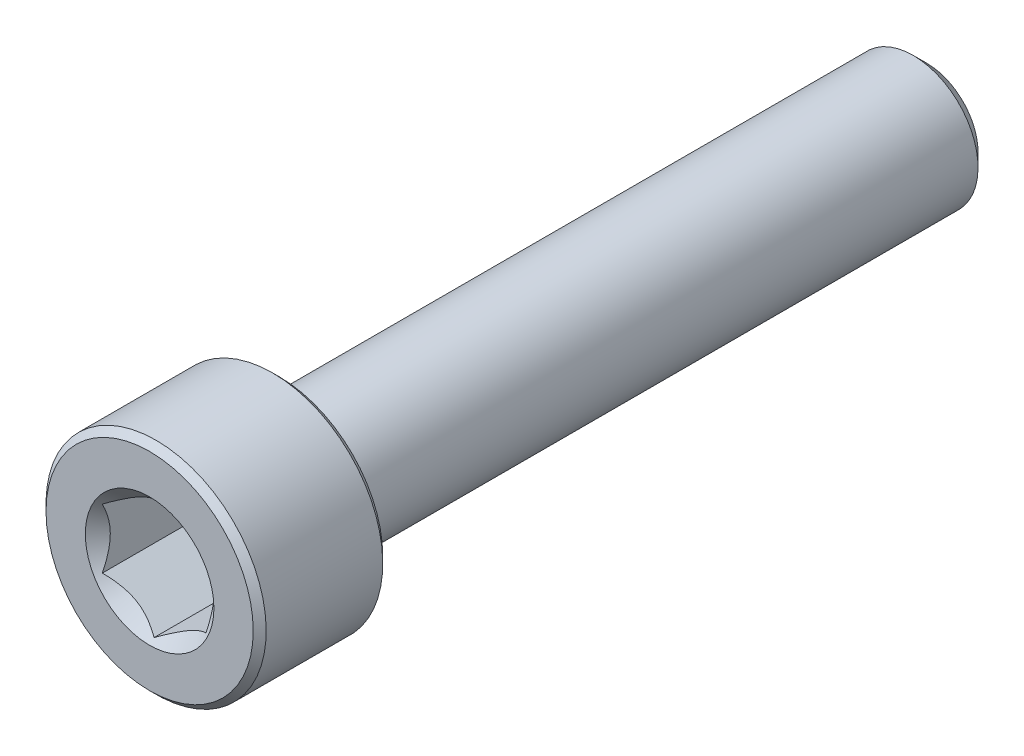
ISO-10303-21;
HEADER;
FILE_DESCRIPTION(('STEP AP214'),'2;1');
FILE_NAME('part.step','',(''),(''),'','','');
FILE_SCHEMA(('AUTOMOTIVE_DESIGN { 1 0 10303 214 1 1 1 1 }'));
ENDSEC;
DATA;
#1=APPLICATION_CONTEXT('core data for automotive mechanical design processes');
#2=APPLICATION_PROTOCOL_DEFINITION('international standard','automotive_design',2000,#1);
#3=PRODUCT_CONTEXT('',#1,'mechanical');
#4=PRODUCT('Part','Part','',(#3));
#5=PRODUCT_RELATED_PRODUCT_CATEGORY('part','',(#4));
#6=PRODUCT_DEFINITION_FORMATION('','',#4);
#7=PRODUCT_DEFINITION_CONTEXT('part definition',#1,'design');
#8=PRODUCT_DEFINITION('design','',#6,#7);
#9=PRODUCT_DEFINITION_SHAPE('','',#8);
#10=(LENGTH_UNIT() NAMED_UNIT(*) SI_UNIT(.MILLI.,.METRE.));
#11=(NAMED_UNIT(*) PLANE_ANGLE_UNIT() SI_UNIT($,.RADIAN.));
#12=(NAMED_UNIT(*) SI_UNIT($,.STERADIAN.) SOLID_ANGLE_UNIT());
#13=UNCERTAINTY_MEASURE_WITH_UNIT(LENGTH_MEASURE(1.E-05),#10,'distance_accuracy_value','');
#14=(GEOMETRIC_REPRESENTATION_CONTEXT(3) GLOBAL_UNCERTAINTY_ASSIGNED_CONTEXT((#13)) GLOBAL_UNIT_ASSIGNED_CONTEXT((#10,
#11,#12)) REPRESENTATION_CONTEXT('',''));
#15=CARTESIAN_POINT('',(0.,0.,0.));
#16=DIRECTION('',(0.,0.,1.));
#17=DIRECTION('',(1.,0.,0.));
#18=AXIS2_PLACEMENT_3D('',#15,#16,#17);
#19=CARTESIAN_POINT('',(0.,1.98038475772934,-15.));
#20=DIRECTION('',(0.,0.,-1.));
#21=DIRECTION('',(0.,1.,0.));
#22=AXIS2_PLACEMENT_3D('',#19,#20,#21);
#23=PLANE('',#22);
#24=CARTESIAN_POINT('',(0.,0.,-15.));
#25=DIRECTION('',(0.,0.,-1.));
#26=DIRECTION('',(0.,1.,0.));
#27=AXIS2_PLACEMENT_3D('',#24,#25,#26);
#28=CIRCLE('',#27,1.98038475772934);
#29=CARTESIAN_POINT('',(0.,1.98038475772934,-15.));
#30=VERTEX_POINT('',#29);
#31=EDGE_CURVE('E57',#30,#30,#28,.T.);
#32=ORIENTED_EDGE('',*,*,#31,.T.);
#33=EDGE_LOOP('',(#32));
#34=FACE_BOUND('',#33,.T.);
#35=ADVANCED_FACE('F43',(#34),#23,.T.);
#36=CARTESIAN_POINT('',(0.,0.,-15.));
#37=DIRECTION('',(0.,0.,1.));
#38=DIRECTION('',(0.,-1.,0.));
#39=AXIS2_PLACEMENT_3D('',#36,#37,#38);
#40=CONICAL_SURFACE('',#39,1.98038475772934,0.785398163397445);
#41=CARTESIAN_POINT('',(0.,0.,-14.4803847577293));
#42=DIRECTION('',(0.,0.,-1.));
#43=DIRECTION('',(0.,1.,0.));
#44=AXIS2_PLACEMENT_3D('',#41,#42,#43);
#45=CIRCLE('',#44,2.5);
#46=CARTESIAN_POINT('',(0.,2.5,-14.4803847577293));
#47=VERTEX_POINT('',#46);
#48=EDGE_CURVE('E175',#47,#47,#45,.T.);
#49=ORIENTED_EDGE('',*,*,#48,.T.);
#50=EDGE_LOOP('',(#49));
#51=FACE_BOUND('',#50,.T.);
#52=ORIENTED_EDGE('',*,*,#31,.F.);
#53=EDGE_LOOP('',(#52));
#54=FACE_BOUND('',#53,.T.);
#55=ADVANCED_FACE('F183',(#51,#54),#40,.T.);
#56=CARTESIAN_POINT('',(0.,0.,-15.));
#57=DIRECTION('',(0.,0.,-1.));
#58=DIRECTION('',(0.,1.,0.));
#59=AXIS2_PLACEMENT_3D('',#56,#57,#58);
#60=CYLINDRICAL_SURFACE('',#59,2.5);
#61=CARTESIAN_POINT('',(0.,0.,9.75));
#62=DIRECTION('',(0.,0.,-1.));
#63=DIRECTION('',(0.,1.,0.));
#64=AXIS2_PLACEMENT_3D('',#61,#62,#63);
#65=CIRCLE('',#64,2.5);
#66=CARTESIAN_POINT('',(0.,2.5,9.75));
#67=VERTEX_POINT('',#66);
#68=EDGE_CURVE('E171',#67,#67,#65,.T.);
#69=ORIENTED_EDGE('',*,*,#68,.T.);
#70=EDGE_LOOP('',(#69));
#71=FACE_BOUND('',#70,.T.);
#72=ORIENTED_EDGE('',*,*,#48,.F.);
#73=EDGE_LOOP('',(#72));
#74=FACE_BOUND('',#73,.T.);
#75=ADVANCED_FACE('F185',(#71,#74),#60,.T.);
#76=CARTESIAN_POINT('',(0.,0.,9.75));
#77=DIRECTION('',(0.,0.,-1.));
#78=DIRECTION('',(0.,1.,0.));
#79=AXIS2_PLACEMENT_3D('',#76,#77,#78);
#80=TOROIDAL_SURFACE('',#79,2.75,0.25);
#81=CARTESIAN_POINT('',(0.,0.,10.));
#82=DIRECTION('',(0.,0.,-1.));
#83=DIRECTION('',(0.,1.,0.));
#84=AXIS2_PLACEMENT_3D('',#81,#82,#83);
#85=CIRCLE('',#84,2.75);
#86=CARTESIAN_POINT('',(0.,2.75,10.));
#87=VERTEX_POINT('',#86);
#88=EDGE_CURVE('E167',#87,#87,#85,.T.);
#89=ORIENTED_EDGE('',*,*,#88,.T.);
#90=EDGE_LOOP('',(#89));
#91=FACE_BOUND('',#90,.T.);
#92=ORIENTED_EDGE('',*,*,#68,.F.);
#93=EDGE_LOOP('',(#92));
#94=FACE_BOUND('',#93,.T.);
#95=ADVANCED_FACE('F191',(#91,#94),#80,.F.);
#96=CARTESIAN_POINT('',(0.,4.,10.));
#97=DIRECTION('',(0.,0.,-1.));
#98=DIRECTION('',(0.,1.,0.));
#99=AXIS2_PLACEMENT_3D('',#96,#97,#98);
#100=PLANE('',#99);
#101=CARTESIAN_POINT('',(0.,0.,10.));
#102=DIRECTION('',(0.,0.,-1.));
#103=DIRECTION('',(0.,1.,0.));
#104=AXIS2_PLACEMENT_3D('',#101,#102,#103);
#105=CIRCLE('',#104,4.);
#106=CARTESIAN_POINT('',(0.,4.,10.));
#107=VERTEX_POINT('',#106);
#108=EDGE_CURVE('E163',#107,#107,#105,.T.);
#109=ORIENTED_EDGE('',*,*,#108,.T.);
#110=EDGE_LOOP('',(#109));
#111=FACE_BOUND('',#110,.T.);
#112=ORIENTED_EDGE('',*,*,#88,.F.);
#113=EDGE_LOOP('',(#112));
#114=FACE_BOUND('',#113,.T.);
#115=ADVANCED_FACE('F197',(#111,#114),#100,.T.);
#116=CARTESIAN_POINT('',(0.,0.,10.));
#117=DIRECTION('',(0.,0.,1.));
#118=DIRECTION('',(0.,-1.,0.));
#119=AXIS2_PLACEMENT_3D('',#116,#117,#118);
#120=CONICAL_SURFACE('',#119,4.,0.785398163397448);
#121=CARTESIAN_POINT('',(0.,0.,10.25));
#122=DIRECTION('',(0.,0.,-1.));
#123=DIRECTION('',(0.,1.,0.));
#124=AXIS2_PLACEMENT_3D('',#121,#122,#123);
#125=CIRCLE('',#124,4.25);
#126=CARTESIAN_POINT('',(0.,4.25,10.25));
#127=VERTEX_POINT('',#126);
#128=EDGE_CURVE('E159',#127,#127,#125,.T.);
#129=ORIENTED_EDGE('',*,*,#128,.T.);
#130=EDGE_LOOP('',(#129));
#131=FACE_BOUND('',#130,.T.);
#132=ORIENTED_EDGE('',*,*,#108,.F.);
#133=EDGE_LOOP('',(#132));
#134=FACE_BOUND('',#133,.T.);
#135=ADVANCED_FACE('F201',(#131,#134),#120,.T.);
#136=CARTESIAN_POINT('',(0.,0.,-15.));
#137=DIRECTION('',(0.,0.,-1.));
#138=DIRECTION('',(0.,1.,0.));
#139=AXIS2_PLACEMENT_3D('',#136,#137,#138);
#140=CYLINDRICAL_SURFACE('',#139,4.25);
#141=CARTESIAN_POINT('',(0.,0.,14.75));
#142=DIRECTION('',(0.,0.,-1.));
#143=DIRECTION('',(0.,1.,0.));
#144=AXIS2_PLACEMENT_3D('',#141,#142,#143);
#145=CIRCLE('',#144,4.25);
#146=CARTESIAN_POINT('',(0.,4.25,14.75));
#147=VERTEX_POINT('',#146);
#148=EDGE_CURVE('E155',#147,#147,#145,.T.);
#149=ORIENTED_EDGE('',*,*,#148,.T.);
#150=EDGE_LOOP('',(#149));
#151=FACE_BOUND('',#150,.T.);
#152=ORIENTED_EDGE('',*,*,#128,.F.);
#153=EDGE_LOOP('',(#152));
#154=FACE_BOUND('',#153,.T.);
#155=ADVANCED_FACE('F205',(#151,#154),#140,.T.);
#156=CARTESIAN_POINT('',(0.,0.,14.75));
#157=DIRECTION('',(0.,0.,-1.));
#158=DIRECTION('',(0.,1.,0.));
#159=AXIS2_PLACEMENT_3D('',#156,#157,#158);
#160=CONICAL_SURFACE('',#159,4.25,0.785398163397455);
#161=CARTESIAN_POINT('',(0.,0.,15.));
#162=DIRECTION('',(0.,0.,-1.));
#163=DIRECTION('',(0.,1.,0.));
#164=AXIS2_PLACEMENT_3D('',#161,#162,#163);
#165=CIRCLE('',#164,4.);
#166=CARTESIAN_POINT('',(0.,4.,15.));
#167=VERTEX_POINT('',#166);
#168=EDGE_CURVE('E151',#167,#167,#165,.T.);
#169=ORIENTED_EDGE('',*,*,#168,.T.);
#170=EDGE_LOOP('',(#169));
#171=FACE_BOUND('',#170,.T.);
#172=ORIENTED_EDGE('',*,*,#148,.F.);
#173=EDGE_LOOP('',(#172));
#174=FACE_BOUND('',#173,.T.);
#175=ADVANCED_FACE('F209',(#171,#174),#160,.T.);
#176=CARTESIAN_POINT('',(0.,0.,15.));
#177=DIRECTION('',(0.,0.,1.));
#178=DIRECTION('',(0.,-1.,0.));
#179=AXIS2_PLACEMENT_3D('',#176,#177,#178);
#180=PLANE('',#179);
#181=CARTESIAN_POINT('',(0.,0.,15.));
#182=DIRECTION('',(0.,0.,1.));
#183=DIRECTION('',(1.,0.,0.));
#184=AXIS2_PLACEMENT_3D('',#181,#182,#183);
#185=CIRCLE('',#184,2.48260615751539);
#186=CARTESIAN_POINT('',(2.48260615751539,0.,15.));
#187=VERTEX_POINT('',#186);
#188=EDGE_CURVE('E117',#187,#187,#185,.T.);
#189=ORIENTED_EDGE('',*,*,#188,.F.);
#190=EDGE_LOOP('',(#189));
#191=FACE_BOUND('',#190,.T.);
#192=ORIENTED_EDGE('',*,*,#168,.F.);
#193=EDGE_LOOP('',(#192));
#194=FACE_BOUND('',#193,.T.);
#195=ADVANCED_FACE('F213',(#191,#194),#180,.T.);
#196=CARTESIAN_POINT('',(0.,0.,15.));
#197=DIRECTION('',(0.,0.,1.));
#198=DIRECTION('',(1.,0.,0.));
#199=AXIS2_PLACEMENT_3D('',#196,#197,#198);
#200=CONICAL_SURFACE('',#199,2.48260615751539,0.78539816339745);
#201=ORIENTED_EDGE('',*,*,#188,.T.);
#202=EDGE_LOOP('',(#201));
#203=FACE_BOUND('',#202,.T.);
#204=CARTESIAN_POINT('',(-0.000199999999998729,-2.30951654681234,14.8269103979568));
#205=CARTESIAN_POINT('',(0.0685530340307065,-2.26982196410711,14.7872480094687));
#206=CARTESIAN_POINT('',(0.138455742135512,-2.22946361676572,14.7499149015273));
#207=CARTESIAN_POINT('',(0.280995244550437,-2.1471683966763,14.6815586043793));
#208=CARTESIAN_POINT('',(0.353645597565359,-2.10522369580642,14.6505734529803));
#209=CARTESIAN_POINT('',(0.500141601053972,-2.02064418875706,14.5974951357873));
#210=CARTESIAN_POINT('',(0.573949935246295,-1.97803092714269,14.5752685464197));
#211=CARTESIAN_POINT('',(0.723191631835265,-1.89186619344273,14.5410237359182));
#212=CARTESIAN_POINT('',(0.798620433918153,-1.84831735425552,14.5289799483872));
#213=CARTESIAN_POINT('',(0.928615500671081,-1.7732646674724,14.5181134311487));
#214=CARTESIAN_POINT('',(0.98301378397011,-1.74185780396625,14.5165046728531));
#215=CARTESIAN_POINT('',(1.0917214555197,-1.67909540053412,14.5192137968418));
#216=CARTESIAN_POINT('',(1.14603080592134,-1.64773988246021,14.5235337570011));
#217=CARTESIAN_POINT('',(1.25413672758934,-1.5853248994842,14.537854486653));
#218=CARTESIAN_POINT('',(1.30793265655479,-1.55426580541469,14.5478616120051));
#219=CARTESIAN_POINT('',(1.41459426230557,-1.49268469862228,14.5730073494928));
#220=CARTESIAN_POINT('',(1.46746001007071,-1.46216264491917,14.5881455682854));
#221=CARTESIAN_POINT('',(1.60287973308985,-1.38397803138049,14.6330894226723));
#222=CARTESIAN_POINT('',(1.68459383484948,-1.33680037273297,14.6662837586689));
#223=CARTESIAN_POINT('',(1.8047470372578,-1.26742988897853,14.7223207424145));
#224=CARTESIAN_POINT('',(1.84434285210918,-1.24456923461531,14.7420096221901));
#225=CARTESIAN_POINT('',(1.92280095888787,-1.19927142554652,14.783182237608));
#226=CARTESIAN_POINT('',(1.96166368359374,-1.17683402097614,14.8046648708944));
#227=CARTESIAN_POINT('',(2.0002,-1.15458506832541,14.8269103979568));
#228=B_SPLINE_CURVE_WITH_KNOTS('',3,(#204,#205,#206,#207,#208,#209,#210,#211,#212,#213,#214,
#215,#216,#217,#218,#219,#220,#221,#222,#223,#224,#225,#226,#227),.UNSPECIFIED.,.F.,.F.,(4,2,2,
2,2,2,2,2,2,2,2,4),(0.,0.266420613771063,0.534393751523388,0.798110374376914,1.06116288956936,
1.24939906803722,1.43770123566248,1.62621426093932,1.81471283831913,2.11415604834145,
2.2634717071779,2.41269626969771),.UNSPECIFIED.);
#229=CARTESIAN_POINT('',(0.,-2.3094010767585,14.8267949192431));
#230=VERTEX_POINT('',#229);
#231=CARTESIAN_POINT('',(2.,-1.15470053837925,14.8267949192431));
#232=VERTEX_POINT('',#231);
#233=EDGE_CURVE('E12',#230,#232,#228,.T.);
#234=ORIENTED_EDGE('',*,*,#233,.F.);
#235=CARTESIAN_POINT('',(-2.0002,-1.15458506832541,14.8269103979568));
#236=CARTESIAN_POINT('',(-1.93144696596929,-1.19427965103064,14.7872480094687));
#237=CARTESIAN_POINT('',(-1.86154425786449,-1.23463799837204,14.7499149015273));
#238=CARTESIAN_POINT('',(-1.71900475544956,-1.31693321846145,14.6815586043793));
#239=CARTESIAN_POINT('',(-1.64635440243464,-1.35887791933134,14.6505734529803));
#240=CARTESIAN_POINT('',(-1.49985839894603,-1.44345742638069,14.5974951357873));
#241=CARTESIAN_POINT('',(-1.42605006475371,-1.48607068799507,14.5752685464197));
#242=CARTESIAN_POINT('',(-1.27680836816474,-1.57223542169503,14.5410237359182));
#243=CARTESIAN_POINT('',(-1.20137956608185,-1.61578426088223,14.5289799483872));
#244=CARTESIAN_POINT('',(-1.07138449932892,-1.69083694766536,14.5181134311487));
#245=CARTESIAN_POINT('',(-1.01698621602989,-1.72224381117151,14.5165046728531));
#246=CARTESIAN_POINT('',(-0.908278544480305,-1.78500621460364,14.5192137968418));
#247=CARTESIAN_POINT('',(-0.85396919407866,-1.81636173267754,14.5235337570011));
#248=CARTESIAN_POINT('',(-0.745863272410661,-1.87877671565355,14.537854486653));
#249=CARTESIAN_POINT('',(-0.692067343445206,-1.90983580972306,14.5478616120051));
#250=CARTESIAN_POINT('',(-0.585405737694425,-1.97141691651548,14.5730073494928));
#251=CARTESIAN_POINT('',(-0.532539989929286,-2.00193897021859,14.5881455682854));
#252=CARTESIAN_POINT('',(-0.397120266910154,-2.08012358375727,14.6330894226723));
#253=CARTESIAN_POINT('',(-0.31540616515052,-2.12730124240478,14.6662837586689));
#254=CARTESIAN_POINT('',(-0.195252962742196,-2.19667172615922,14.7223207424145));
#255=CARTESIAN_POINT('',(-0.155657147890821,-2.21953238052245,14.7420096221901));
#256=CARTESIAN_POINT('',(-0.0771990411121259,-2.26483018959124,14.783182237608));
#257=CARTESIAN_POINT('',(-0.0383363164062579,-2.28726759416161,14.8046648708944));
#258=CARTESIAN_POINT('',(0.00020000000000141,-2.30951654681234,14.8269103979568));
#259=B_SPLINE_CURVE_WITH_KNOTS('',3,(#235,#236,#237,#238,#239,#240,#241,#242,#243,#244,#245,
#246,#247,#248,#249,#250,#251,#252,#253,#254,#255,#256,#257,#258),.UNSPECIFIED.,.F.,.F.,(4,2,2,
2,2,2,2,2,2,2,2,4),(0.,0.266420613771064,0.53439375152339,0.798110374376915,1.06116288956937,
1.24939906803722,1.43770123566248,1.62621426093932,1.81471283831913,2.11415604834145,
2.26347170717791,2.41269626969771),.UNSPECIFIED.);
#260=CARTESIAN_POINT('',(-2.,-1.15470053837925,14.8267949192431));
#261=VERTEX_POINT('',#260);
#262=EDGE_CURVE('E102',#261,#230,#259,.T.);
#263=ORIENTED_EDGE('',*,*,#262,.F.);
#264=CARTESIAN_POINT('',(-2.,-2.42398175579868,15.6599545105457));
#265=CARTESIAN_POINT('',(-2.,-2.3654738763041,15.6148351758713));
#266=CARTESIAN_POINT('',(-2.,-2.30665236661135,15.5701161756265));
#267=CARTESIAN_POINT('',(-2.,-2.18825331969085,15.4816622121418));
#268=CARTESIAN_POINT('',(-2.,-2.12867560822125,15.4379274823771));
#269=CARTESIAN_POINT('',(-2.,-2.00820019262835,15.3513142462896));
#270=CARTESIAN_POINT('',(-2.,-1.94729585350119,15.3084449389484));
#271=CARTESIAN_POINT('',(-2.,-1.82447635639412,15.2241846501668));
#272=CARTESIAN_POINT('',(-2.,-1.76256126823391,15.1827935672392));
#273=CARTESIAN_POINT('',(-2.,-1.63352305153315,15.0992199648467));
#274=CARTESIAN_POINT('',(-2.,-1.56632133333278,15.0571581799355));
#275=CARTESIAN_POINT('',(-2.,-1.43035896394453,14.9756383889365));
#276=CARTESIAN_POINT('',(-2.,-1.3615985170145,14.9361800443101));
#277=CARTESIAN_POINT('',(-2.,-1.22246684398892,14.8606863637627));
#278=CARTESIAN_POINT('',(-2.,-1.15210085009344,14.8246414605252));
#279=CARTESIAN_POINT('',(-2.,-1.00937086384545,14.7567889383447));
#280=CARTESIAN_POINT('',(-2.,-0.937007838648202,14.724979310286));
#281=CARTESIAN_POINT('',(-2.,-0.797532850709096,14.6696918996687));
#282=CARTESIAN_POINT('',(-2.,-0.73062786798457,14.6456972616385));
#283=CARTESIAN_POINT('',(-2.,-0.595101218410189,14.6030621374066));
#284=CARTESIAN_POINT('',(-2.,-0.526479443554564,14.5844219889886));
#285=CARTESIAN_POINT('',(-2.,-0.389131528451131,14.5538205255166));
#286=CARTESIAN_POINT('',(-2.,-0.320433088583213,14.5417369815865));
#287=CARTESIAN_POINT('',(-2.,-0.182167175628637,14.5245029259217));
#288=CARTESIAN_POINT('',(-2.,-0.112599890436882,14.5193509405131));
#289=CARTESIAN_POINT('',(-2.,0.0235742388197046,14.5164261236486));
#290=CARTESIAN_POINT('',(-2.,0.0901742622543225,14.5183334186349));
#291=CARTESIAN_POINT('',(-2.,0.22286064727918,14.5286844259992));
#292=CARTESIAN_POINT('',(-2.,0.288946962142557,14.537128726115));
#293=CARTESIAN_POINT('',(-2.,0.421249515605843,14.5602169544548));
#294=CARTESIAN_POINT('',(-2.,0.48744624734062,14.574970869731));
#295=CARTESIAN_POINT('',(-2.,0.618375539180381,14.6098579982816));
#296=CARTESIAN_POINT('',(-2.,0.683108176846779,14.6299909258717));
#297=CARTESIAN_POINT('',(-2.,0.881750195572363,14.699485149858));
#298=CARTESIAN_POINT('',(-2.,1.01295821830486,14.7565400033525));
#299=CARTESIAN_POINT('',(-2.,1.26925973679032,14.8835183967961));
#300=CARTESIAN_POINT('',(-2.,1.39432972284545,14.9534871660011));
#301=CARTESIAN_POINT('',(-2.,1.57512870977373,15.0627644548654));
#302=CARTESIAN_POINT('',(-2.,1.63281357796872,15.0989012241787));
#303=CARTESIAN_POINT('',(-2.,1.74719269140407,15.1727216099303));
#304=CARTESIAN_POINT('',(-2.,1.80388686201493,15.2104053421917));
#305=CARTESIAN_POINT('',(-2.,1.91595826038669,15.2867305219709));
#306=CARTESIAN_POINT('',(-2.,1.97134240267412,15.3253618677048));
#307=CARTESIAN_POINT('',(-2.,2.08135060816028,15.4036615543687));
#308=CARTESIAN_POINT('',(-2.,2.13597487670731,15.4433296064566));
#309=CARTESIAN_POINT('',(-2.,2.19028039622782,15.4834228737147));
#310=B_SPLINE_CURVE_WITH_KNOTS('',3,(#264,#265,#266,#267,#268,#269,#270,#271,#272,#273,#274,
#275,#276,#277,#278,#279,#280,#281,#282,#283,#284,#285,#286,#287,#288,#289,#290,#291,#292,#293,
#294,#295,#296,#297,#298,#299,#300,#301,#302,#303,#304,#305,#306,#307,#308,#309),.UNSPECIFIED.,
.F.,.F.,(4,2,2,2,2,2,2,2,2,2,2,2,2,2,2,2,2,2,2,2,2,2,4),(0.,0.221657667100339,0.443367370127324,
0.666786125723386,0.89018951294144,1.12798201434515,1.36574353320624,1.60281759521649,
1.83977879106023,2.05282811904838,2.26589088413717,2.47483185958037,2.68372840641278,
2.88327763021218,3.08284479743513,3.28604242448891,3.48922926167214,3.91721633282416,
4.34673183999753,4.55091998635569,4.75512344852471,4.95768958131487,5.1601998654356),.UNSPECIFIED.);
#311=CARTESIAN_POINT('',(-2.,1.15470053837925,14.8267949192431));
#312=VERTEX_POINT('',#311);
#313=EDGE_CURVE('E116',#312,#261,#310,.F.);
#314=ORIENTED_EDGE('',*,*,#313,.F.);
#315=CARTESIAN_POINT('',(0.000199999999999905,2.30951654681234,14.8269103979568));
#316=CARTESIAN_POINT('',(-0.068553034030706,2.26982196410711,14.7872480094687));
#317=CARTESIAN_POINT('',(-0.138455742135512,2.22946361676572,14.7499149015273));
#318=CARTESIAN_POINT('',(-0.280995244550437,2.1471683966763,14.6815586043793));
#319=CARTESIAN_POINT('',(-0.353645597565359,2.10522369580642,14.6505734529803));
#320=CARTESIAN_POINT('',(-0.500141601053972,2.02064418875706,14.5974951357873));
#321=CARTESIAN_POINT('',(-0.573949935246295,1.97803092714269,14.5752685464197));
#322=CARTESIAN_POINT('',(-0.723191631835265,1.89186619344273,14.5410237359182));
#323=CARTESIAN_POINT('',(-0.798620433918153,1.84831735425552,14.5289799483872));
#324=CARTESIAN_POINT('',(-0.92861550067108,1.7732646674724,14.5181134311487));
#325=CARTESIAN_POINT('',(-0.98301378397011,1.74185780396625,14.5165046728531));
#326=CARTESIAN_POINT('',(-1.09172145551969,1.67909540053412,14.5192137968418));
#327=CARTESIAN_POINT('',(-1.14603080592134,1.64773988246021,14.5235337570011));
#328=CARTESIAN_POINT('',(-1.25413672758934,1.5853248994842,14.537854486653));
#329=CARTESIAN_POINT('',(-1.30793265655479,1.55426580541469,14.5478616120051));
#330=CARTESIAN_POINT('',(-1.41459426230557,1.49268469862228,14.5730073494928));
#331=CARTESIAN_POINT('',(-1.46746001007071,1.46216264491916,14.5881455682854));
#332=CARTESIAN_POINT('',(-1.60287973308984,1.38397803138048,14.6330894226723));
#333=CARTESIAN_POINT('',(-1.68459383484948,1.33680037273297,14.6662837586689));
#334=CARTESIAN_POINT('',(-1.8047470372578,1.26742988897853,14.7223207424145));
#335=CARTESIAN_POINT('',(-1.84434285210918,1.24456923461531,14.7420096221901));
#336=CARTESIAN_POINT('',(-1.92280095888787,1.19927142554652,14.783182237608));
#337=CARTESIAN_POINT('',(-1.96166368359374,1.17683402097614,14.8046648708944));
#338=CARTESIAN_POINT('',(-2.0002,1.15458506832541,14.8269103979568));
#339=B_SPLINE_CURVE_WITH_KNOTS('',3,(#315,#316,#317,#318,#319,#320,#321,#322,#323,#324,#325,
#326,#327,#328,#329,#330,#331,#332,#333,#334,#335,#336,#337,#338),.UNSPECIFIED.,.F.,.F.,(4,2,2,
2,2,2,2,2,2,2,2,4),(0.,0.266420613771063,0.534393751523389,0.798110374376915,1.06116288956937,
1.24939906803722,1.43770123566248,1.62621426093932,1.81471283831913,2.11415604834145,
2.2634717071779,2.41269626969771),.UNSPECIFIED.);
#340=CARTESIAN_POINT('',(0.,2.3094010767585,14.8267949192431));
#341=VERTEX_POINT('',#340);
#342=EDGE_CURVE('E264',#341,#312,#339,.T.);
#343=ORIENTED_EDGE('',*,*,#342,.F.);
#344=CARTESIAN_POINT('',(2.0002,1.15458506832541,14.8269103979568));
#345=CARTESIAN_POINT('',(1.93144696596929,1.19427965103064,14.7872480094687));
#346=CARTESIAN_POINT('',(1.86154425786449,1.23463799837204,14.7499149015273));
#347=CARTESIAN_POINT('',(1.71900475544956,1.31693321846145,14.6815586043793));
#348=CARTESIAN_POINT('',(1.64635440243464,1.35887791933134,14.6505734529803));
#349=CARTESIAN_POINT('',(1.49985839894603,1.44345742638069,14.5974951357873));
#350=CARTESIAN_POINT('',(1.42605006475371,1.48607068799507,14.5752685464197));
#351=CARTESIAN_POINT('',(1.27680836816474,1.57223542169503,14.5410237359182));
#352=CARTESIAN_POINT('',(1.20137956608185,1.61578426088223,14.5289799483872));
#353=CARTESIAN_POINT('',(1.07138449932892,1.69083694766536,14.5181134311487));
#354=CARTESIAN_POINT('',(1.01698621602989,1.72224381117151,14.5165046728531));
#355=CARTESIAN_POINT('',(0.908278544480305,1.78500621460364,14.5192137968418));
#356=CARTESIAN_POINT('',(0.85396919407866,1.81636173267754,14.5235337570011));
#357=CARTESIAN_POINT('',(0.745863272410661,1.87877671565355,14.537854486653));
#358=CARTESIAN_POINT('',(0.692067343445207,1.90983580972306,14.5478616120051));
#359=CARTESIAN_POINT('',(0.585405737694426,1.97141691651547,14.5730073494928));
#360=CARTESIAN_POINT('',(0.532539989929286,2.00193897021859,14.5881455682854));
#361=CARTESIAN_POINT('',(0.397120266910155,2.08012358375727,14.6330894226723));
#362=CARTESIAN_POINT('',(0.315406165150521,2.12730124240478,14.6662837586689));
#363=CARTESIAN_POINT('',(0.195252962742197,2.19667172615922,14.7223207424145));
#364=CARTESIAN_POINT('',(0.155657147890823,2.21953238052245,14.7420096221901));
#365=CARTESIAN_POINT('',(0.0771990411121273,2.26483018959124,14.783182237608));
#366=CARTESIAN_POINT('',(0.0383363164062591,2.28726759416161,14.8046648708944));
#367=CARTESIAN_POINT('',(-0.000200000000000571,2.30951654681234,14.8269103979568));
#368=B_SPLINE_CURVE_WITH_KNOTS('',3,(#344,#345,#346,#347,#348,#349,#350,#351,#352,#353,#354,
#355,#356,#357,#358,#359,#360,#361,#362,#363,#364,#365,#366,#367),.UNSPECIFIED.,.F.,.F.,(4,2,2,
2,2,2,2,2,2,2,2,4),(0.,0.266420613771064,0.534393751523388,0.798110374376915,1.06116288956936,
1.24939906803722,1.43770123566248,1.62621426093932,1.81471283831913,2.11415604834145,
2.26347170717791,2.41269626969771),.UNSPECIFIED.);
#369=CARTESIAN_POINT('',(2.,1.15470053837925,14.8267949192431));
#370=VERTEX_POINT('',#369);
#371=EDGE_CURVE('E237',#370,#341,#368,.T.);
#372=ORIENTED_EDGE('',*,*,#371,.F.);
#373=CARTESIAN_POINT('',(2.,-2.42398175579868,15.6599545105457));
#374=CARTESIAN_POINT('',(2.,-2.3654738763041,15.6148351758713));
#375=CARTESIAN_POINT('',(2.,-2.30665236661135,15.5701161756265));
#376=CARTESIAN_POINT('',(2.,-2.18825331969084,15.4816622121418));
#377=CARTESIAN_POINT('',(2.,-2.12867560822125,15.4379274823771));
#378=CARTESIAN_POINT('',(2.,-2.00820019262835,15.3513142462896));
#379=CARTESIAN_POINT('',(2.,-1.94729585350119,15.3084449389484));
#380=CARTESIAN_POINT('',(2.,-1.82447635639412,15.2241846501668));
#381=CARTESIAN_POINT('',(2.,-1.76256126823391,15.1827935672392));
#382=CARTESIAN_POINT('',(2.,-1.63352305153315,15.0992199648467));
#383=CARTESIAN_POINT('',(2.,-1.56632133333278,15.0571581799355));
#384=CARTESIAN_POINT('',(2.,-1.43035896394453,14.9756383889365));
#385=CARTESIAN_POINT('',(2.,-1.3615985170145,14.9361800443101));
#386=CARTESIAN_POINT('',(2.,-1.22246684398892,14.8606863637627));
#387=CARTESIAN_POINT('',(2.,-1.15210085009344,14.8246414605252));
#388=CARTESIAN_POINT('',(2.,-1.00937086384545,14.7567889383447));
#389=CARTESIAN_POINT('',(2.,-0.937007838648201,14.724979310286));
#390=CARTESIAN_POINT('',(2.,-0.797532850709095,14.6696918996687));
#391=CARTESIAN_POINT('',(2.,-0.73062786798457,14.6456972616385));
#392=CARTESIAN_POINT('',(2.,-0.595101218410189,14.6030621374066));
#393=CARTESIAN_POINT('',(2.,-0.526479443554564,14.5844219889886));
#394=CARTESIAN_POINT('',(2.,-0.389131528451131,14.5538205255166));
#395=CARTESIAN_POINT('',(2.,-0.320433088583213,14.5417369815865));
#396=CARTESIAN_POINT('',(2.,-0.182167175628637,14.5245029259217));
#397=CARTESIAN_POINT('',(2.,-0.112599890436883,14.5193509405131));
#398=CARTESIAN_POINT('',(2.,0.0235742388197035,14.5164261236486));
#399=CARTESIAN_POINT('',(2.,0.0901742622543213,14.5183334186349));
#400=CARTESIAN_POINT('',(2.,0.222860647279179,14.5286844259992));
#401=CARTESIAN_POINT('',(2.,0.288946962142556,14.537128726115));
#402=CARTESIAN_POINT('',(2.,0.421249515605842,14.5602169544548));
#403=CARTESIAN_POINT('',(2.,0.487446247340619,14.574970869731));
#404=CARTESIAN_POINT('',(2.,0.61837553918038,14.6098579982816));
#405=CARTESIAN_POINT('',(2.,0.683108176846778,14.6299909258717));
#406=CARTESIAN_POINT('',(2.,0.881750195572362,14.699485149858));
#407=CARTESIAN_POINT('',(2.,1.01295821830486,14.7565400033525));
#408=CARTESIAN_POINT('',(2.,1.26925973679032,14.8835183967961));
#409=CARTESIAN_POINT('',(2.,1.39432972284544,14.9534871660011));
#410=CARTESIAN_POINT('',(2.,1.57512870977373,15.0627644548654));
#411=CARTESIAN_POINT('',(2.,1.63281357796871,15.0989012241787));
#412=CARTESIAN_POINT('',(2.,1.74719269140407,15.1727216099303));
#413=CARTESIAN_POINT('',(2.,1.80388686201493,15.2104053421917));
#414=CARTESIAN_POINT('',(2.,1.91595826038669,15.2867305219709));
#415=CARTESIAN_POINT('',(2.,1.97134240267412,15.3253618677048));
#416=CARTESIAN_POINT('',(2.,2.08135060816028,15.4036615543687));
#417=CARTESIAN_POINT('',(2.,2.13597487670731,15.4433296064566));
#418=CARTESIAN_POINT('',(2.,2.19028039622781,15.4834228737147));
#419=B_SPLINE_CURVE_WITH_KNOTS('',3,(#373,#374,#375,#376,#377,#378,#379,#380,#381,#382,#383,
#384,#385,#386,#387,#388,#389,#390,#391,#392,#393,#394,#395,#396,#397,#398,#399,#400,#401,#402,
#403,#404,#405,#406,#407,#408,#409,#410,#411,#412,#413,#414,#415,#416,#417,#418),.UNSPECIFIED.,
.F.,.F.,(4,2,2,2,2,2,2,2,2,2,2,2,2,2,2,2,2,2,2,2,2,2,4),(0.,0.221657667100339,0.443367370127324,
0.666786125723386,0.89018951294144,1.12798201434515,1.36574353320624,1.60281759521649,
1.83977879106023,2.05282811904838,2.26589088413717,2.47483185958037,2.68372840641278,
2.88327763021218,3.08284479743513,3.28604242448891,3.48922926167214,3.91721633282416,
4.34673183999753,4.55091998635568,4.75512344852471,4.95768958131487,5.1601998654356),.UNSPECIFIED.);
#420=EDGE_CURVE('E64',#232,#370,#419,.T.);
#421=ORIENTED_EDGE('',*,*,#420,.F.);
#422=EDGE_LOOP('',(#234,#263,#314,#343,#372,#421));
#423=FACE_BOUND('',#422,.T.);
#424=ADVANCED_FACE('F101',(#203,#423),#200,.F.);
#425=CARTESIAN_POINT('',(0.,4.,11.));
#426=DIRECTION('',(0.,0.,-1.));
#427=DIRECTION('',(0.,1.,0.));
#428=AXIS2_PLACEMENT_3D('',#425,#426,#427);
#429=PLANE('',#428);
#430=DIRECTION('',(0.866025403784438,0.5,0.));
#431=VECTOR('',#430,1.);
#432=CARTESIAN_POINT('',(0.,-2.3094010767585,11.));
#433=LINE('',#432,#431);
#434=CARTESIAN_POINT('',(0.,-2.3094010767585,11.));
#435=VERTEX_POINT('',#434);
#436=CARTESIAN_POINT('',(2.,-1.15470053837925,11.));
#437=VERTEX_POINT('',#436);
#438=EDGE_CURVE('E120',#435,#437,#433,.T.);
#439=ORIENTED_EDGE('',*,*,#438,.T.);
#440=DIRECTION('',(0.,1.,0.));
#441=VECTOR('',#440,1.);
#442=CARTESIAN_POINT('',(2.,-1.15470053837925,11.));
#443=LINE('',#442,#441);
#444=CARTESIAN_POINT('',(2.,1.15470053837925,11.));
#445=VERTEX_POINT('',#444);
#446=EDGE_CURVE('E71',#437,#445,#443,.T.);
#447=ORIENTED_EDGE('',*,*,#446,.T.);
#448=DIRECTION('',(-0.866025403784439,0.5,0.));
#449=VECTOR('',#448,1.);
#450=CARTESIAN_POINT('',(2.,1.15470053837925,11.));
#451=LINE('',#450,#449);
#452=CARTESIAN_POINT('',(0.,2.3094010767585,11.));
#453=VERTEX_POINT('',#452);
#454=EDGE_CURVE('E131',#445,#453,#451,.T.);
#455=ORIENTED_EDGE('',*,*,#454,.T.);
#456=DIRECTION('',(-0.866025403784439,-0.5,0.));
#457=VECTOR('',#456,1.);
#458=CARTESIAN_POINT('',(0.,2.3094010767585,11.));
#459=LINE('',#458,#457);
#460=CARTESIAN_POINT('',(-2.,1.15470053837925,11.));
#461=VERTEX_POINT('',#460);
#462=EDGE_CURVE('E140',#453,#461,#459,.T.);
#463=ORIENTED_EDGE('',*,*,#462,.T.);
#464=DIRECTION('',(0.,-1.,0.));
#465=VECTOR('',#464,1.);
#466=CARTESIAN_POINT('',(-2.,1.15470053837925,11.));
#467=LINE('',#466,#465);
#468=CARTESIAN_POINT('',(-2.,-1.15470053837925,11.));
#469=VERTEX_POINT('',#468);
#470=EDGE_CURVE('E135',#461,#469,#467,.T.);
#471=ORIENTED_EDGE('',*,*,#470,.T.);
#472=DIRECTION('',(0.866025403784439,-0.5,0.));
#473=VECTOR('',#472,1.);
#474=CARTESIAN_POINT('',(-2.,-1.15470053837925,11.));
#475=LINE('',#474,#473);
#476=EDGE_CURVE('E122',#469,#435,#475,.T.);
#477=ORIENTED_EDGE('',*,*,#476,.T.);
#478=EDGE_LOOP('',(#439,#447,#455,#463,#471,#477));
#479=FACE_BOUND('',#478,.T.);
#480=ADVANCED_FACE('F218',(#479),#429,.F.);
#481=CARTESIAN_POINT('',(0.,-2.3094010767585,3.88989907339222));
#482=DIRECTION('',(0.5,-0.866025403784438,0.));
#483=DIRECTION('',(0.866025403784438,0.5,0.));
#484=AXIS2_PLACEMENT_3D('',#481,#482,#483);
#485=PLANE('',#484);
#486=DIRECTION('',(0.,0.,1.));
#487=VECTOR('',#486,1.);
#488=CARTESIAN_POINT('',(0.,-2.3094010767585,3.88989907339222));
#489=LINE('',#488,#487);
#490=EDGE_CURVE('E111',#435,#230,#489,.T.);
#491=ORIENTED_EDGE('',*,*,#490,.T.);
#492=ORIENTED_EDGE('',*,*,#233,.T.);
#493=DIRECTION('',(0.,0.,1.));
#494=VECTOR('',#493,1.);
#495=CARTESIAN_POINT('',(2.,-1.15470053837925,3.88989907339222));
#496=LINE('',#495,#494);
#497=EDGE_CURVE('E126',#437,#232,#496,.T.);
#498=ORIENTED_EDGE('',*,*,#497,.F.);
#499=ORIENTED_EDGE('',*,*,#438,.F.);
#500=EDGE_LOOP('',(#491,#492,#498,#499));
#501=FACE_BOUND('',#500,.T.);
#502=ADVANCED_FACE('F119',(#501),#485,.F.);
#503=CARTESIAN_POINT('',(-2.,-1.15470053837925,3.88989907339222));
#504=DIRECTION('',(-0.5,-0.866025403784439,0.));
#505=DIRECTION('',(0.866025403784439,-0.5,0.));
#506=AXIS2_PLACEMENT_3D('',#503,#504,#505);
#507=PLANE('',#506);
#508=DIRECTION('',(0.,0.,1.));
#509=VECTOR('',#508,1.);
#510=CARTESIAN_POINT('',(-2.,-1.15470053837925,3.88989907339222));
#511=LINE('',#510,#509);
#512=EDGE_CURVE('E114',#469,#261,#511,.T.);
#513=ORIENTED_EDGE('',*,*,#512,.T.);
#514=ORIENTED_EDGE('',*,*,#262,.T.);
#515=ORIENTED_EDGE('',*,*,#490,.F.);
#516=ORIENTED_EDGE('',*,*,#476,.F.);
#517=EDGE_LOOP('',(#513,#514,#515,#516));
#518=FACE_BOUND('',#517,.T.);
#519=ADVANCED_FACE('F110',(#518),#507,.F.);
#520=CARTESIAN_POINT('',(-2.,1.15470053837925,3.88989907339222));
#521=DIRECTION('',(-1.,0.,0.));
#522=DIRECTION('',(0.,0.,1.));
#523=AXIS2_PLACEMENT_3D('',#520,#521,#522);
#524=PLANE('',#523);
#525=DIRECTION('',(0.,0.,1.));
#526=VECTOR('',#525,1.);
#527=CARTESIAN_POINT('',(-2.,1.15470053837925,3.88989907339222));
#528=LINE('',#527,#526);
#529=EDGE_CURVE('E136',#461,#312,#528,.T.);
#530=ORIENTED_EDGE('',*,*,#529,.T.);
#531=ORIENTED_EDGE('',*,*,#313,.T.);
#532=ORIENTED_EDGE('',*,*,#512,.F.);
#533=ORIENTED_EDGE('',*,*,#470,.F.);
#534=EDGE_LOOP('',(#530,#531,#532,#533));
#535=FACE_BOUND('',#534,.T.);
#536=ADVANCED_FACE('F274',(#535),#524,.F.);
#537=CARTESIAN_POINT('',(0.,2.3094010767585,3.88989907339222));
#538=DIRECTION('',(-0.5,0.866025403784438,0.));
#539=DIRECTION('',(-0.866025403784439,-0.5,0.));
#540=AXIS2_PLACEMENT_3D('',#537,#538,#539);
#541=PLANE('',#540);
#542=DIRECTION('',(0.,0.,1.));
#543=VECTOR('',#542,1.);
#544=CARTESIAN_POINT('',(0.,2.3094010767585,3.88989907339222));
#545=LINE('',#544,#543);
#546=EDGE_CURVE('E141',#453,#341,#545,.T.);
#547=ORIENTED_EDGE('',*,*,#546,.T.);
#548=ORIENTED_EDGE('',*,*,#342,.T.);
#549=ORIENTED_EDGE('',*,*,#529,.F.);
#550=ORIENTED_EDGE('',*,*,#462,.F.);
#551=EDGE_LOOP('',(#547,#548,#549,#550));
#552=FACE_BOUND('',#551,.T.);
#553=ADVANCED_FACE('F271',(#552),#541,.F.);
#554=CARTESIAN_POINT('',(2.,1.15470053837925,3.88989907339222));
#555=DIRECTION('',(0.5,0.866025403784439,0.));
#556=DIRECTION('',(-0.866025403784439,0.5,0.));
#557=AXIS2_PLACEMENT_3D('',#554,#555,#556);
#558=PLANE('',#557);
#559=DIRECTION('',(0.,0.,1.));
#560=VECTOR('',#559,1.);
#561=CARTESIAN_POINT('',(2.,1.15470053837925,3.88989907339222));
#562=LINE('',#561,#560);
#563=EDGE_CURVE('E145',#445,#370,#562,.T.);
#564=ORIENTED_EDGE('',*,*,#563,.T.);
#565=ORIENTED_EDGE('',*,*,#371,.T.);
#566=ORIENTED_EDGE('',*,*,#546,.F.);
#567=ORIENTED_EDGE('',*,*,#454,.F.);
#568=EDGE_LOOP('',(#564,#565,#566,#567));
#569=FACE_BOUND('',#568,.T.);
#570=ADVANCED_FACE('F226',(#569),#558,.F.);
#571=CARTESIAN_POINT('',(2.,-1.15470053837925,3.88989907339222));
#572=DIRECTION('',(1.,0.,0.));
#573=DIRECTION('',(0.,0.,-1.));
#574=AXIS2_PLACEMENT_3D('',#571,#572,#573);
#575=PLANE('',#574);
#576=ORIENTED_EDGE('',*,*,#497,.T.);
#577=ORIENTED_EDGE('',*,*,#420,.T.);
#578=ORIENTED_EDGE('',*,*,#563,.F.);
#579=ORIENTED_EDGE('',*,*,#446,.F.);
#580=EDGE_LOOP('',(#576,#577,#578,#579));
#581=FACE_BOUND('',#580,.T.);
#582=ADVANCED_FACE('F222',(#581),#575,.F.);
#583=CLOSED_SHELL('',(#35,#55,#75,#95,#115,#135,#155,#175,#195,#424,#480,#502,#519,#536,#553,
#570,#582));
#584=MANIFOLD_SOLID_BREP('B2',#583);
#585=ADVANCED_BREP_SHAPE_REPRESENTATION('',(#18,#584),#14);
#586=SHAPE_DEFINITION_REPRESENTATION(#9,#585);
ENDSEC;
END-ISO-10303-21;
